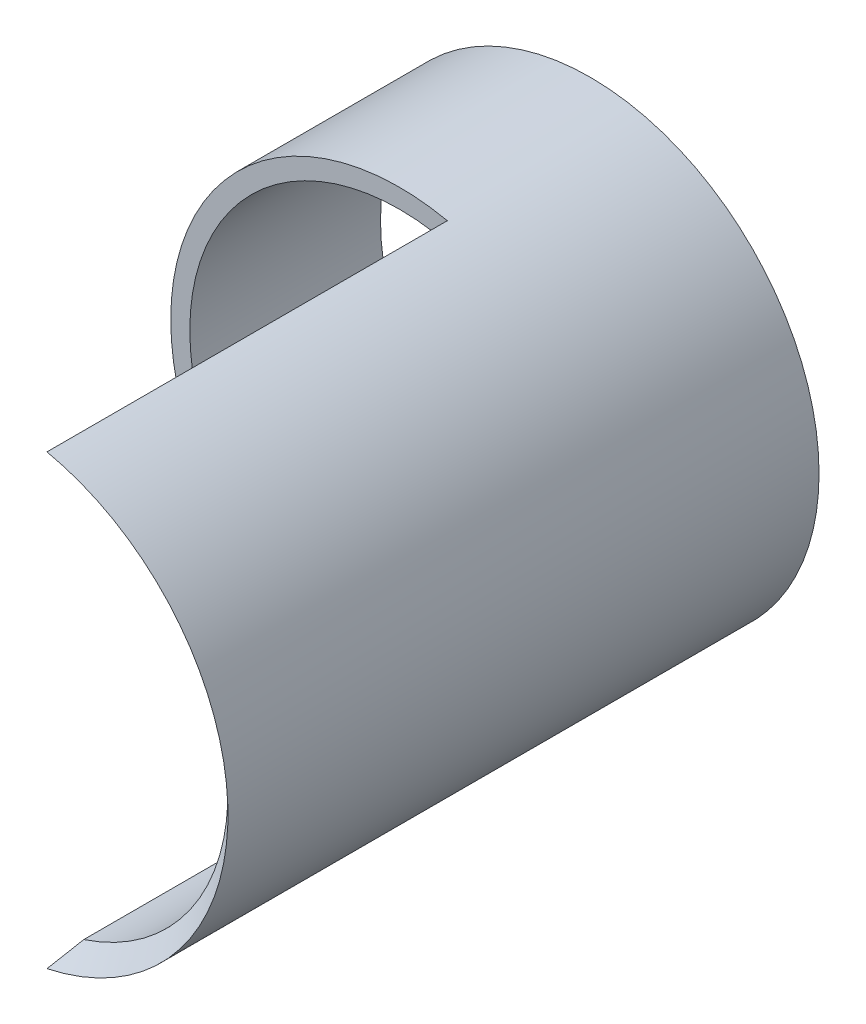
ISO-10303-21;
HEADER;
FILE_DESCRIPTION(('STEP AP214'),'2;1');
FILE_NAME('part.step','',(''),(''),'','','');
FILE_SCHEMA(('AUTOMOTIVE_DESIGN { 1 0 10303 214 1 1 1 1 }'));
ENDSEC;
DATA;
#1=APPLICATION_CONTEXT('core data for automotive mechanical design processes');
#2=APPLICATION_PROTOCOL_DEFINITION('international standard','automotive_design',2000,#1);
#3=PRODUCT_CONTEXT('',#1,'mechanical');
#4=PRODUCT('Part','Part','',(#3));
#5=PRODUCT_RELATED_PRODUCT_CATEGORY('part','',(#4));
#6=PRODUCT_DEFINITION_FORMATION('','',#4);
#7=PRODUCT_DEFINITION_CONTEXT('part definition',#1,'design');
#8=PRODUCT_DEFINITION('design','',#6,#7);
#9=PRODUCT_DEFINITION_SHAPE('','',#8);
#10=(LENGTH_UNIT() NAMED_UNIT(*) SI_UNIT(.MILLI.,.METRE.));
#11=(NAMED_UNIT(*) PLANE_ANGLE_UNIT() SI_UNIT($,.RADIAN.));
#12=(NAMED_UNIT(*) SI_UNIT($,.STERADIAN.) SOLID_ANGLE_UNIT());
#13=UNCERTAINTY_MEASURE_WITH_UNIT(LENGTH_MEASURE(1.E-05),#10,'distance_accuracy_value','');
#14=(GEOMETRIC_REPRESENTATION_CONTEXT(3) GLOBAL_UNCERTAINTY_ASSIGNED_CONTEXT((#13)) GLOBAL_UNIT_ASSIGNED_CONTEXT((#10,
#11,#12)) REPRESENTATION_CONTEXT('',''));
#15=CARTESIAN_POINT('',(0.,0.,0.));
#16=DIRECTION('',(0.,0.,1.));
#17=DIRECTION('',(1.,0.,0.));
#18=AXIS2_PLACEMENT_3D('',#15,#16,#17);
#19=CARTESIAN_POINT('',(0.,0.,20.));
#20=DIRECTION('',(0.,0.,-1.));
#21=DIRECTION('',(-1.,0.,0.));
#22=AXIS2_PLACEMENT_3D('',#19,#20,#21);
#23=CYLINDRICAL_SURFACE('',#22,24.);
#24=DIRECTION('',(0.,0.,-1.));
#25=VECTOR('',#24,1.);
#26=CARTESIAN_POINT('',(5.01325434053211,-23.4705620068446,41.));
#27=LINE('',#26,#25);
#28=CARTESIAN_POINT('',(5.01325434053211,-23.4705620068446,61.9999999999999));
#29=VERTEX_POINT('',#28);
#30=CARTESIAN_POINT('',(5.01325434053212,-23.4705620068446,20.));
#31=VERTEX_POINT('',#30);
#32=EDGE_CURVE('E186',#29,#31,#27,.T.);
#33=ORIENTED_EDGE('',*,*,#32,.T.);
#34=CARTESIAN_POINT('',(0.,0.,20.));
#35=DIRECTION('',(0.,0.,1.));
#36=DIRECTION('',(1.,0.,0.));
#37=AXIS2_PLACEMENT_3D('',#34,#35,#36);
#38=CIRCLE('',#37,24.);
#39=CARTESIAN_POINT('',(5.01325434053215,23.4705620068446,20.));
#40=VERTEX_POINT('',#39);
#41=EDGE_CURVE('E181',#40,#31,#38,.T.);
#42=ORIENTED_EDGE('',*,*,#41,.F.);
#43=DIRECTION('',(0.,0.,-1.));
#44=VECTOR('',#43,1.);
#45=CARTESIAN_POINT('',(5.01325434053214,23.4705620068446,41.));
#46=LINE('',#45,#44);
#47=CARTESIAN_POINT('',(5.01325434053214,23.4705620068446,61.9999999999999));
#48=VERTEX_POINT('',#47);
#49=EDGE_CURVE('E92',#40,#48,#46,.F.);
#50=ORIENTED_EDGE('',*,*,#49,.T.);
#51=CARTESIAN_POINT('',(0.,0.,61.9999999999999));
#52=DIRECTION('',(0.,0.,1.));
#53=DIRECTION('',(1.,0.,0.));
#54=AXIS2_PLACEMENT_3D('',#51,#52,#53);
#55=CIRCLE('',#54,24.);
#56=EDGE_CURVE('E82',#48,#29,#55,.F.);
#57=ORIENTED_EDGE('',*,*,#56,.T.);
#58=EDGE_LOOP('',(#33,#42,#50,#57));
#59=FACE_BOUND('',#58,.T.);
#60=CARTESIAN_POINT('',(0.,0.,0.));
#61=DIRECTION('',(0.,0.,1.));
#62=DIRECTION('',(1.,0.,0.));
#63=AXIS2_PLACEMENT_3D('',#60,#61,#62);
#64=CIRCLE('',#63,24.);
#65=CARTESIAN_POINT('',(24.,0.,0.));
#66=VERTEX_POINT('',#65);
#67=EDGE_CURVE('E180',#66,#66,#64,.T.);
#68=ORIENTED_EDGE('',*,*,#67,.T.);
#69=EDGE_LOOP('',(#68));
#70=FACE_BOUND('',#69,.T.);
#71=ADVANCED_FACE('F35',(#59,#70),#23,.T.);
#72=CARTESIAN_POINT('',(0.,0.,20.));
#73=DIRECTION('',(0.,0.,1.));
#74=DIRECTION('',(1.,0.,0.));
#75=AXIS2_PLACEMENT_3D('',#72,#73,#74);
#76=PLANE('',#75);
#77=ORIENTED_EDGE('',*,*,#41,.T.);
#78=DIRECTION('',(-0.586301969977922,-0.810092587300987,0.));
#79=VECTOR('',#78,1.);
#80=CARTESIAN_POINT('',(0.,-30.3973683071415,20.));
#81=LINE('',#80,#79);
#82=CARTESIAN_POINT('',(6.87500000000001,-20.8981907111597,20.));
#83=VERTEX_POINT('',#82);
#84=EDGE_CURVE('E11',#31,#83,#81,.F.);
#85=ORIENTED_EDGE('',*,*,#84,.T.);
#86=CARTESIAN_POINT('',(0.,0.,20.));
#87=DIRECTION('',(0.,0.,-1.));
#88=DIRECTION('',(-1.,0.,0.));
#89=AXIS2_PLACEMENT_3D('',#86,#87,#88);
#90=CIRCLE('',#89,22.);
#91=CARTESIAN_POINT('',(6.8750000000001,20.8981907111596,20.));
#92=VERTEX_POINT('',#91);
#93=EDGE_CURVE('E51',#83,#92,#90,.T.);
#94=ORIENTED_EDGE('',*,*,#93,.T.);
#95=DIRECTION('',(0.586301969977932,-0.81009258730098,0.));
#96=VECTOR('',#95,1.);
#97=CARTESIAN_POINT('',(6.8750000000001,20.8981907111596,20.));
#98=LINE('',#97,#96);
#99=EDGE_CURVE('E91',#92,#40,#98,.F.);
#100=ORIENTED_EDGE('',*,*,#99,.T.);
#101=EDGE_LOOP('',(#77,#85,#94,#100));
#102=FACE_BOUND('',#101,.T.);
#103=ADVANCED_FACE('F115',(#102),#76,.T.);
#104=CARTESIAN_POINT('',(0.,0.,0.));
#105=DIRECTION('',(0.,0.,1.));
#106=DIRECTION('',(1.,0.,0.));
#107=AXIS2_PLACEMENT_3D('',#104,#105,#106);
#108=PLANE('',#107);
#109=CARTESIAN_POINT('',(0.,0.,0.));
#110=DIRECTION('',(0.,0.,-1.));
#111=DIRECTION('',(-1.,0.,0.));
#112=AXIS2_PLACEMENT_3D('',#109,#110,#111);
#113=CIRCLE('',#112,22.);
#114=CARTESIAN_POINT('',(-22.,0.,0.));
#115=VERTEX_POINT('',#114);
#116=EDGE_CURVE('E177',#115,#115,#113,.T.);
#117=ORIENTED_EDGE('',*,*,#116,.F.);
#118=EDGE_LOOP('',(#117));
#119=FACE_BOUND('',#118,.T.);
#120=ORIENTED_EDGE('',*,*,#67,.F.);
#121=EDGE_LOOP('',(#120));
#122=FACE_BOUND('',#121,.T.);
#123=ADVANCED_FACE('F120',(#119,#122),#108,.F.);
#124=CARTESIAN_POINT('',(0.,0.,20.));
#125=DIRECTION('',(0.,0.,-1.));
#126=DIRECTION('',(-1.,0.,0.));
#127=AXIS2_PLACEMENT_3D('',#124,#125,#126);
#128=CYLINDRICAL_SURFACE('',#127,22.);
#129=ORIENTED_EDGE('',*,*,#93,.F.);
#130=DIRECTION('',(0.,0.,-1.));
#131=VECTOR('',#130,1.);
#132=CARTESIAN_POINT('',(6.87500000000001,-20.8981907111597,20.));
#133=LINE('',#132,#131);
#134=CARTESIAN_POINT('',(6.87500000000001,-20.8981907111597,59.9999999999999));
#135=VERTEX_POINT('',#134);
#136=EDGE_CURVE('E80',#83,#135,#133,.F.);
#137=ORIENTED_EDGE('',*,*,#136,.T.);
#138=CARTESIAN_POINT('',(0.,0.,59.9999999999999));
#139=DIRECTION('',(0.,0.,-1.));
#140=DIRECTION('',(-1.,0.,0.));
#141=AXIS2_PLACEMENT_3D('',#138,#139,#140);
#142=CIRCLE('',#141,22.);
#143=CARTESIAN_POINT('',(6.8750000000001,20.8981907111596,59.9999999999999));
#144=VERTEX_POINT('',#143);
#145=EDGE_CURVE('E74',#135,#144,#142,.F.);
#146=ORIENTED_EDGE('',*,*,#145,.T.);
#147=DIRECTION('',(0.,0.,-1.));
#148=VECTOR('',#147,1.);
#149=CARTESIAN_POINT('',(6.8750000000001,20.8981907111596,20.));
#150=LINE('',#149,#148);
#151=EDGE_CURVE('E79',#144,#92,#150,.T.);
#152=ORIENTED_EDGE('',*,*,#151,.T.);
#153=EDGE_LOOP('',(#129,#137,#146,#152));
#154=FACE_BOUND('',#153,.T.);
#155=ORIENTED_EDGE('',*,*,#116,.T.);
#156=EDGE_LOOP('',(#155));
#157=FACE_BOUND('',#156,.T.);
#158=ADVANCED_FACE('F76',(#154,#157),#128,.F.);
#159=CARTESIAN_POINT('',(0.,0.,70.));
#160=DIRECTION('',(0.,0.,1.));
#161=DIRECTION('',(1.,0.,0.));
#162=AXIS2_PLACEMENT_3D('',#159,#160,#161);
#163=CONICAL_SURFACE('',#162,32.0000000000002,0.785398163397454);
#164=ORIENTED_EDGE('',*,*,#145,.F.);
#165=CARTESIAN_POINT('',(6.87500000000001,-20.8981907111597,59.9999999999999));
#166=CARTESIAN_POINT('',(6.71678383121159,-21.1167977636509,60.1582264715532));
#167=CARTESIAN_POINT('',(6.55940019284034,-21.334254510064,60.3188580896086));
#168=CARTESIAN_POINT('',(6.24622740292412,-21.7669649027394,60.6444515421511));
#169=CARTESIAN_POINT('',(6.09043790417395,-21.9822190287346,60.8094124045678));
#170=CARTESIAN_POINT('',(5.78031707292778,-22.4107125345121,61.143250157083));
#171=CARTESIAN_POINT('',(5.62598569719936,-22.6239519740287,61.3121269305613));
#172=CARTESIAN_POINT('',(5.3186443959995,-23.0486050071455,61.6534710015054));
#173=CARTESIAN_POINT('',(5.16563477235727,-23.2600181837086,61.8259390899226));
#174=CARTESIAN_POINT('',(5.01325434053212,-23.4705620068446,61.9999999999999));
#175=B_SPLINE_CURVE_WITH_KNOTS('',3,(#165,#166,#167,#168,#169,#170,#171,#172,#173,#174),
.UNSPECIFIED.,.F.,.F.,(4,2,2,2,4),(0.,0.938438635510162,1.87666833091767,2.81487012055881,
3.7532807722356),.UNSPECIFIED.);
#176=EDGE_CURVE('E44',#135,#29,#175,.T.);
#177=ORIENTED_EDGE('',*,*,#176,.T.);
#178=ORIENTED_EDGE('',*,*,#56,.F.);
#179=CARTESIAN_POINT('',(5.01325434053214,23.4705620068446,61.9999999999999));
#180=CARTESIAN_POINT('',(5.1656347723573,23.2600181837086,61.8259390899226));
#181=CARTESIAN_POINT('',(5.31864439599954,23.0486050071455,61.6534710015054));
#182=CARTESIAN_POINT('',(5.62598569719941,22.6239519740287,61.3121269305613));
#183=CARTESIAN_POINT('',(5.78031707292783,22.4107125345121,61.143250157083));
#184=CARTESIAN_POINT('',(6.09043790417401,21.9822190287346,60.8094124045678));
#185=CARTESIAN_POINT('',(6.24622740292419,21.7669649027394,60.6444515421511));
#186=CARTESIAN_POINT('',(6.55940019284042,21.334254510064,60.3188580896086));
#187=CARTESIAN_POINT('',(6.71678383121168,21.1167977636508,60.1582264715532));
#188=CARTESIAN_POINT('',(6.8750000000001,20.8981907111596,59.9999999999999));
#189=B_SPLINE_CURVE_WITH_KNOTS('',3,(#179,#180,#181,#182,#183,#184,#185,#186,#187,#188),
.UNSPECIFIED.,.F.,.F.,(4,2,2,2,4),(0.,0.938410651676795,1.87661244131795,2.81484213672547,
3.75328077223564),.UNSPECIFIED.);
#190=EDGE_CURVE('E86',#48,#144,#189,.T.);
#191=ORIENTED_EDGE('',*,*,#190,.T.);
#192=EDGE_LOOP('',(#164,#177,#178,#191));
#193=FACE_BOUND('',#192,.T.);
#194=ADVANCED_FACE('F87',(#193),#163,.F.);
#195=CARTESIAN_POINT('',(6.8750000000001,20.8981907111596,20.));
#196=DIRECTION('',(0.81009258730098,0.586301969977932,0.));
#197=DIRECTION('',(0.,0.,-1.));
#198=AXIS2_PLACEMENT_3D('',#195,#196,#197);
#199=PLANE('',#198);
#200=ORIENTED_EDGE('',*,*,#190,.F.);
#201=ORIENTED_EDGE('',*,*,#49,.F.);
#202=ORIENTED_EDGE('',*,*,#99,.F.);
#203=ORIENTED_EDGE('',*,*,#151,.F.);
#204=EDGE_LOOP('',(#200,#201,#202,#203));
#205=FACE_BOUND('',#204,.T.);
#206=ADVANCED_FACE('F95',(#205),#199,.F.);
#207=CARTESIAN_POINT('',(0.,-30.3973683071415,20.));
#208=DIRECTION('',(0.810092587300987,-0.586301969977922,0.));
#209=DIRECTION('',(0.,0.,-1.));
#210=AXIS2_PLACEMENT_3D('',#207,#208,#209);
#211=PLANE('',#210);
#212=ORIENTED_EDGE('',*,*,#176,.F.);
#213=ORIENTED_EDGE('',*,*,#136,.F.);
#214=ORIENTED_EDGE('',*,*,#84,.F.);
#215=ORIENTED_EDGE('',*,*,#32,.F.);
#216=EDGE_LOOP('',(#212,#213,#214,#215));
#217=FACE_BOUND('',#216,.T.);
#218=ADVANCED_FACE('F37',(#217),#211,.F.);
#219=CLOSED_SHELL('',(#71,#103,#123,#158,#194,#206,#218));
#220=MANIFOLD_SOLID_BREP('B2',#219);
#221=ADVANCED_BREP_SHAPE_REPRESENTATION('',(#18,#220),#14);
#222=SHAPE_DEFINITION_REPRESENTATION(#9,#221);
ENDSEC;
END-ISO-10303-21;
